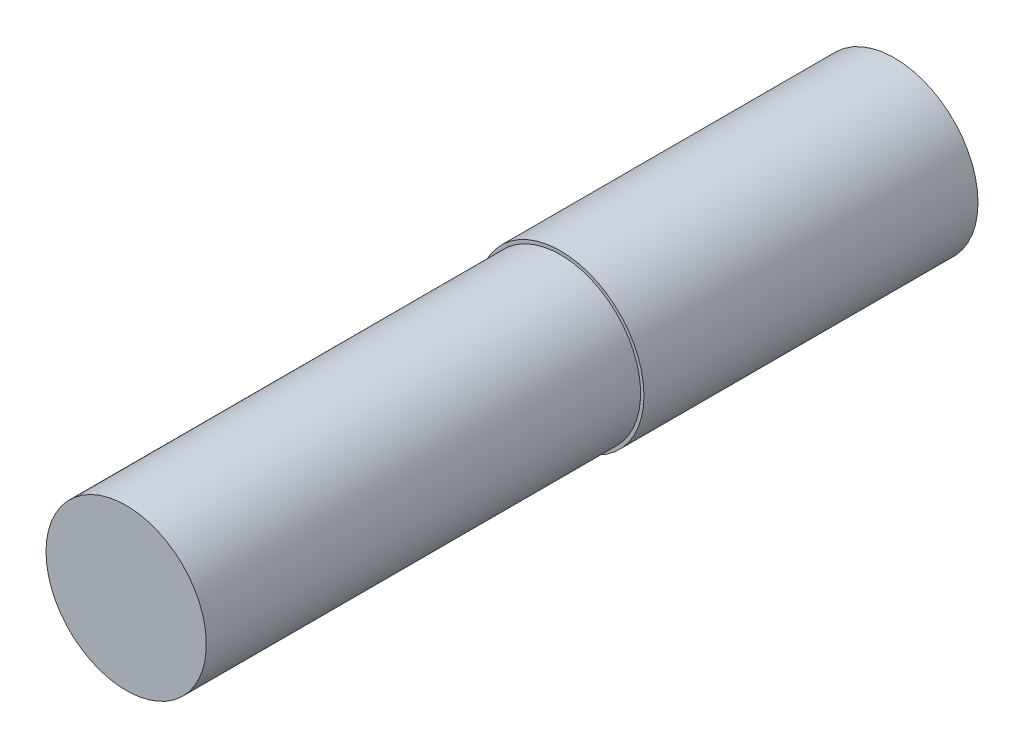
ISO-10303-21;
HEADER;
FILE_DESCRIPTION(('STEP AP214'),'2;1');
FILE_NAME('part.step','',(''),(''),'','','');
FILE_SCHEMA(('AUTOMOTIVE_DESIGN { 1 0 10303 214 1 1 1 1 }'));
ENDSEC;
DATA;
#1=APPLICATION_CONTEXT('core data for automotive mechanical design processes');
#2=APPLICATION_PROTOCOL_DEFINITION('international standard','automotive_design',2000,#1);
#3=PRODUCT_CONTEXT('',#1,'mechanical');
#4=PRODUCT('Part','Part','',(#3));
#5=PRODUCT_RELATED_PRODUCT_CATEGORY('part','',(#4));
#6=PRODUCT_DEFINITION_FORMATION('','',#4);
#7=PRODUCT_DEFINITION_CONTEXT('part definition',#1,'design');
#8=PRODUCT_DEFINITION('design','',#6,#7);
#9=PRODUCT_DEFINITION_SHAPE('','',#8);
#10=(LENGTH_UNIT() NAMED_UNIT(*) SI_UNIT(.MILLI.,.METRE.));
#11=(NAMED_UNIT(*) PLANE_ANGLE_UNIT() SI_UNIT($,.RADIAN.));
#12=(NAMED_UNIT(*) SI_UNIT($,.STERADIAN.) SOLID_ANGLE_UNIT());
#13=UNCERTAINTY_MEASURE_WITH_UNIT(LENGTH_MEASURE(1.E-05),#10,'distance_accuracy_value','');
#14=(GEOMETRIC_REPRESENTATION_CONTEXT(3) GLOBAL_UNCERTAINTY_ASSIGNED_CONTEXT((#13)) GLOBAL_UNIT_ASSIGNED_CONTEXT((#10,
#11,#12)) REPRESENTATION_CONTEXT('',''));
#15=CARTESIAN_POINT('',(0.,0.,0.));
#16=DIRECTION('',(0.,0.,1.));
#17=DIRECTION('',(1.,0.,0.));
#18=AXIS2_PLACEMENT_3D('',#15,#16,#17);
#19=CARTESIAN_POINT('',(0.,0.,10.));
#20=DIRECTION('',(0.,0.,-1.));
#21=DIRECTION('',(-1.,0.,0.));
#22=AXIS2_PLACEMENT_3D('',#19,#20,#21);
#23=CYLINDRICAL_SURFACE('',#22,2.5);
#24=CARTESIAN_POINT('',(0.,0.,10.));
#25=DIRECTION('',(0.,0.,1.));
#26=DIRECTION('',(1.,0.,0.));
#27=AXIS2_PLACEMENT_3D('',#24,#25,#26);
#28=CIRCLE('',#27,2.5);
#29=CARTESIAN_POINT('',(2.5,0.,10.));
#30=VERTEX_POINT('',#29);
#31=EDGE_CURVE('E37',#30,#30,#28,.T.);
#32=ORIENTED_EDGE('',*,*,#31,.F.);
#33=EDGE_LOOP('',(#32));
#34=FACE_BOUND('',#33,.T.);
#35=CARTESIAN_POINT('',(0.,0.,0.));
#36=DIRECTION('',(0.,0.,1.));
#37=DIRECTION('',(1.,0.,0.));
#38=AXIS2_PLACEMENT_3D('',#35,#36,#37);
#39=CIRCLE('',#38,2.5);
#40=CARTESIAN_POINT('',(2.5,0.,0.));
#41=VERTEX_POINT('',#40);
#42=EDGE_CURVE('E33',#41,#41,#39,.T.);
#43=ORIENTED_EDGE('',*,*,#42,.T.);
#44=EDGE_LOOP('',(#43));
#45=FACE_BOUND('',#44,.T.);
#46=ADVANCED_FACE('F30',(#34,#45),#23,.T.);
#47=CARTESIAN_POINT('',(0.,0.,10.));
#48=DIRECTION('',(0.,0.,1.));
#49=DIRECTION('',(1.,0.,0.));
#50=AXIS2_PLACEMENT_3D('',#47,#48,#49);
#51=PLANE('',#50);
#52=CARTESIAN_POINT('',(0.,0.,10.));
#53=DIRECTION('',(0.,0.,1.));
#54=DIRECTION('',(1.,0.,0.));
#55=AXIS2_PLACEMENT_3D('',#52,#53,#54);
#56=CIRCLE('',#55,2.4);
#57=CARTESIAN_POINT('',(-2.4,0.,10.));
#58=VERTEX_POINT('',#57);
#59=EDGE_CURVE('E10',#58,#58,#56,.T.);
#60=ORIENTED_EDGE('',*,*,#59,.F.);
#61=EDGE_LOOP('',(#60));
#62=FACE_BOUND('',#61,.T.);
#63=ORIENTED_EDGE('',*,*,#31,.T.);
#64=EDGE_LOOP('',(#63));
#65=FACE_BOUND('',#64,.T.);
#66=ADVANCED_FACE('F54',(#62,#65),#51,.T.);
#67=CARTESIAN_POINT('',(0.,0.,0.));
#68=DIRECTION('',(0.,0.,1.));
#69=DIRECTION('',(1.,0.,0.));
#70=AXIS2_PLACEMENT_3D('',#67,#68,#69);
#71=PLANE('',#70);
#72=ORIENTED_EDGE('',*,*,#42,.F.);
#73=EDGE_LOOP('',(#72));
#74=FACE_BOUND('',#73,.T.);
#75=ADVANCED_FACE('F51',(#74),#71,.F.);
#76=CARTESIAN_POINT('',(0.,0.,23.));
#77=DIRECTION('',(0.,0.,-1.));
#78=DIRECTION('',(-1.,0.,0.));
#79=AXIS2_PLACEMENT_3D('',#76,#77,#78);
#80=CYLINDRICAL_SURFACE('',#79,2.4);
#81=CARTESIAN_POINT('',(0.,0.,23.));
#82=DIRECTION('',(0.,0.,1.));
#83=DIRECTION('',(1.,0.,0.));
#84=AXIS2_PLACEMENT_3D('',#81,#82,#83);
#85=CIRCLE('',#84,2.4);
#86=CARTESIAN_POINT('',(-2.4,0.,23.));
#87=VERTEX_POINT('',#86);
#88=EDGE_CURVE('E43',#87,#87,#85,.T.);
#89=CARTESIAN_POINT('',(-2.4,0.,23.));
#90=CARTESIAN_POINT('',(-2.4,0.,22.8645833333333));
#91=CARTESIAN_POINT('',(-2.4,0.,22.7291666666667));
#92=CARTESIAN_POINT('',(-2.4,0.,22.4583333333333));
#93=CARTESIAN_POINT('',(-2.4,0.,22.3229166666667));
#94=CARTESIAN_POINT('',(-2.4,0.,22.0520833333333));
#95=CARTESIAN_POINT('',(-2.4,0.,21.9166666666667));
#96=CARTESIAN_POINT('',(-2.4,0.,21.6458333333333));
#97=CARTESIAN_POINT('',(-2.4,0.,21.5104166666667));
#98=CARTESIAN_POINT('',(-2.4,0.,21.2395833333333));
#99=CARTESIAN_POINT('',(-2.4,0.,21.1041666666667));
#100=CARTESIAN_POINT('',(-2.4,0.,20.8333333333333));
#101=CARTESIAN_POINT('',(-2.4,0.,20.6979166666667));
#102=CARTESIAN_POINT('',(-2.4,0.,20.4270833333333));
#103=CARTESIAN_POINT('',(-2.4,0.,20.2916666666667));
#104=CARTESIAN_POINT('',(-2.4,0.,20.0208333333333));
#105=CARTESIAN_POINT('',(-2.4,0.,19.8854166666667));
#106=CARTESIAN_POINT('',(-2.4,0.,19.6145833333333));
#107=CARTESIAN_POINT('',(-2.4,0.,19.4791666666667));
#108=CARTESIAN_POINT('',(-2.4,0.,19.2083333333333));
#109=CARTESIAN_POINT('',(-2.4,0.,19.0729166666667));
#110=CARTESIAN_POINT('',(-2.4,0.,18.8020833333333));
#111=CARTESIAN_POINT('',(-2.4,0.,18.6666666666667));
#112=CARTESIAN_POINT('',(-2.4,0.,18.3958333333333));
#113=CARTESIAN_POINT('',(-2.4,0.,18.2604166666667));
#114=CARTESIAN_POINT('',(-2.4,0.,17.9895833333333));
#115=CARTESIAN_POINT('',(-2.4,0.,17.8541666666667));
#116=CARTESIAN_POINT('',(-2.4,0.,17.5833333333333));
#117=CARTESIAN_POINT('',(-2.4,0.,17.4479166666667));
#118=CARTESIAN_POINT('',(-2.4,0.,17.1770833333333));
#119=CARTESIAN_POINT('',(-2.4,0.,17.0416666666667));
#120=CARTESIAN_POINT('',(-2.4,0.,16.7708333333333));
#121=CARTESIAN_POINT('',(-2.4,0.,16.6354166666667));
#122=CARTESIAN_POINT('',(-2.4,0.,16.3645833333333));
#123=CARTESIAN_POINT('',(-2.4,0.,16.2291666666667));
#124=CARTESIAN_POINT('',(-2.4,0.,15.9583333333333));
#125=CARTESIAN_POINT('',(-2.4,0.,15.8229166666667));
#126=CARTESIAN_POINT('',(-2.4,0.,15.5520833333333));
#127=CARTESIAN_POINT('',(-2.4,0.,15.4166666666667));
#128=CARTESIAN_POINT('',(-2.4,0.,15.1458333333333));
#129=CARTESIAN_POINT('',(-2.4,0.,15.0104166666667));
#130=CARTESIAN_POINT('',(-2.4,0.,14.7395833333333));
#131=CARTESIAN_POINT('',(-2.4,0.,14.6041666666667));
#132=CARTESIAN_POINT('',(-2.4,0.,14.3333333333333));
#133=CARTESIAN_POINT('',(-2.4,0.,14.1979166666667));
#134=CARTESIAN_POINT('',(-2.4,0.,13.9270833333333));
#135=CARTESIAN_POINT('',(-2.4,0.,13.7916666666667));
#136=CARTESIAN_POINT('',(-2.4,0.,13.5208333333333));
#137=CARTESIAN_POINT('',(-2.4,0.,13.3854166666667));
#138=CARTESIAN_POINT('',(-2.4,0.,13.1145833333333));
#139=CARTESIAN_POINT('',(-2.4,0.,12.9791666666667));
#140=CARTESIAN_POINT('',(-2.4,0.,12.7083333333333));
#141=CARTESIAN_POINT('',(-2.4,0.,12.5729166666667));
#142=CARTESIAN_POINT('',(-2.4,0.,12.3020833333333));
#143=CARTESIAN_POINT('',(-2.4,0.,12.1666666666667));
#144=CARTESIAN_POINT('',(-2.4,0.,11.8958333333333));
#145=CARTESIAN_POINT('',(-2.4,0.,11.7604166666667));
#146=CARTESIAN_POINT('',(-2.4,0.,11.4895833333333));
#147=CARTESIAN_POINT('',(-2.4,0.,11.3541666666667));
#148=CARTESIAN_POINT('',(-2.4,0.,11.0833333333333));
#149=CARTESIAN_POINT('',(-2.4,0.,10.9479166666667));
#150=CARTESIAN_POINT('',(-2.4,0.,10.6770833333333));
#151=CARTESIAN_POINT('',(-2.4,0.,10.5416666666667));
#152=CARTESIAN_POINT('',(-2.4,0.,10.2708333333333));
#153=CARTESIAN_POINT('',(-2.4,0.,10.1354166666667));
#154=CARTESIAN_POINT('',(-2.4,0.,10.));
#155=B_SPLINE_CURVE_WITH_KNOTS('',3,(#89,#90,#91,#92,#93,#94,#95,#96,#97,#98,#99,#100,#101,#102,
#103,#104,#105,#106,#107,#108,#109,#110,#111,#112,#113,#114,#115,#116,#117,#118,#119,#120,#121,
#122,#123,#124,#125,#126,#127,#128,#129,#130,#131,#132,#133,#134,#135,#136,#137,#138,#139,#140,
#141,#142,#143,#144,#145,#146,#147,#148,#149,#150,#151,#152,#153,#154),.UNSPECIFIED.,.F.,.F.,(4,
2,2,2,2,2,2,2,2,2,2,2,2,2,2,2,2,2,2,2,2,2,2,2,2,2,2,2,2,2,2,2,4),(0.,0.406249999999997,
0.812499999999997,1.21875,1.625,2.03125,2.4375,2.84375,3.25,3.65625,4.0625,4.46875,4.875,
5.28125,5.6875,6.09375,6.5,6.90625,7.3125,7.71875,8.125,8.53124999999999,8.9375,9.34375,9.75,
10.15625,10.5625,10.96875,11.375,11.78125,12.1875,12.59375,13.),.UNSPECIFIED.);
#156=EDGE_CURVE('BSEAM53',#87,#58,#155,.T.);
#157=ORIENTED_EDGE('',*,*,#88,.F.);
#158=ORIENTED_EDGE('',*,*,#59,.T.);
#159=ORIENTED_EDGE('',*,*,#156,.T.);
#160=ORIENTED_EDGE('',*,*,#156,.F.);
#161=EDGE_LOOP('',(#157,#159,#158,#160));
#162=FACE_BOUND('',#161,.T.);
#163=ADVANCED_FACE('F53',(#162),#80,.T.);
#164=CARTESIAN_POINT('',(0.,0.,23.));
#165=DIRECTION('',(0.,0.,1.));
#166=DIRECTION('',(1.,0.,0.));
#167=AXIS2_PLACEMENT_3D('',#164,#165,#166);
#168=PLANE('',#167);
#169=ORIENTED_EDGE('',*,*,#88,.T.);
#170=EDGE_LOOP('',(#169));
#171=FACE_BOUND('',#170,.T.);
#172=ADVANCED_FACE('F59',(#171),#168,.T.);
#173=CLOSED_SHELL('',(#46,#66,#75,#163,#172));
#174=MANIFOLD_SOLID_BREP('B2',#173);
#175=ADVANCED_BREP_SHAPE_REPRESENTATION('',(#18,#174),#14);
#176=SHAPE_DEFINITION_REPRESENTATION(#9,#175);
ENDSEC;
END-ISO-10303-21;
